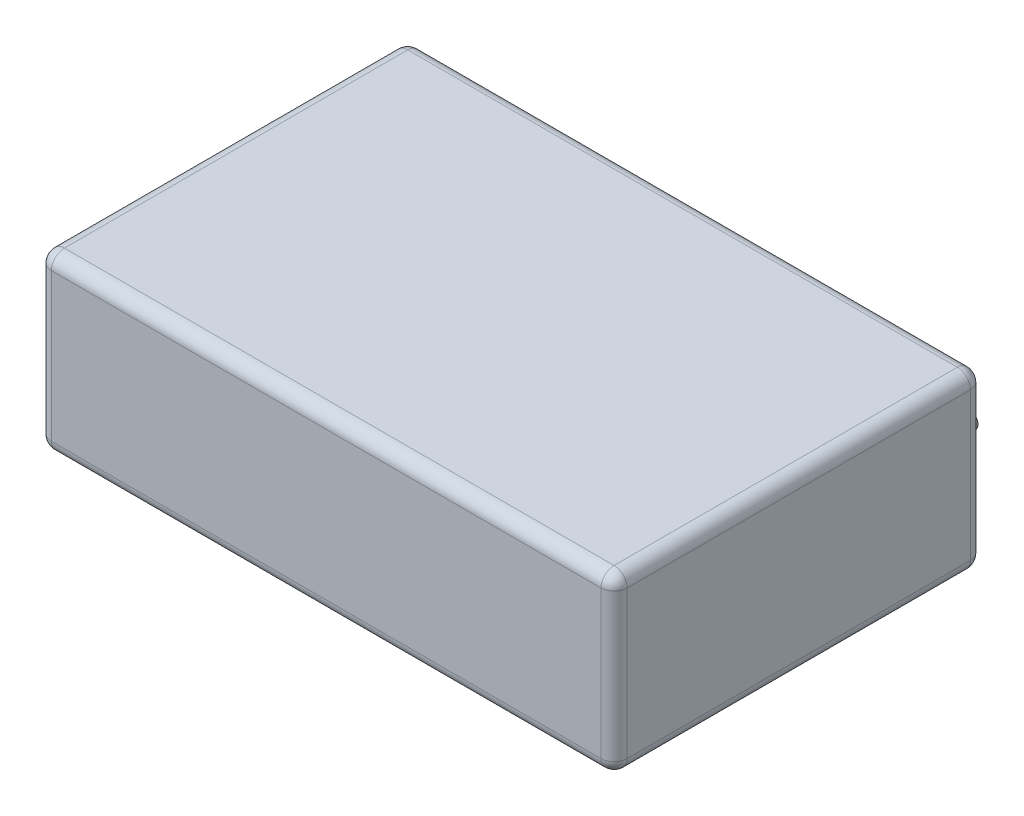
ISO-10303-21;
HEADER;
FILE_DESCRIPTION(('STEP AP214'),'2;1');
FILE_NAME('part.step','',(''),(''),'','','');
FILE_SCHEMA(('AUTOMOTIVE_DESIGN { 1 0 10303 214 1 1 1 1 }'));
ENDSEC;
DATA;
#1=APPLICATION_CONTEXT('core data for automotive mechanical design processes');
#2=APPLICATION_PROTOCOL_DEFINITION('international standard','automotive_design',2000,#1);
#3=PRODUCT_CONTEXT('',#1,'mechanical');
#4=PRODUCT('Part','Part','',(#3));
#5=PRODUCT_RELATED_PRODUCT_CATEGORY('part','',(#4));
#6=PRODUCT_DEFINITION_FORMATION('','',#4);
#7=PRODUCT_DEFINITION_CONTEXT('part definition',#1,'design');
#8=PRODUCT_DEFINITION('design','',#6,#7);
#9=PRODUCT_DEFINITION_SHAPE('','',#8);
#10=(LENGTH_UNIT() NAMED_UNIT(*) SI_UNIT(.MILLI.,.METRE.));
#11=(NAMED_UNIT(*) PLANE_ANGLE_UNIT() SI_UNIT($,.RADIAN.));
#12=(NAMED_UNIT(*) SI_UNIT($,.STERADIAN.) SOLID_ANGLE_UNIT());
#13=UNCERTAINTY_MEASURE_WITH_UNIT(LENGTH_MEASURE(1.E-05),#10,'distance_accuracy_value','');
#14=(GEOMETRIC_REPRESENTATION_CONTEXT(3) GLOBAL_UNCERTAINTY_ASSIGNED_CONTEXT((#13)) GLOBAL_UNIT_ASSIGNED_CONTEXT((#10,
#11,#12)) REPRESENTATION_CONTEXT('',''));
#15=CARTESIAN_POINT('',(0.,0.,0.));
#16=DIRECTION('',(0.,0.,1.));
#17=DIRECTION('',(1.,0.,0.));
#18=AXIS2_PLACEMENT_3D('',#15,#16,#17);
#19=CARTESIAN_POINT('',(-13.25,-3.99999999999999,0.));
#20=DIRECTION('',(0.,0.,1.));
#21=DIRECTION('',(1.,0.,0.));
#22=AXIS2_PLACEMENT_3D('',#19,#20,#21);
#23=PLANE('',#22);
#24=CARTESIAN_POINT('',(-10.9999999999999,0.,0.));
#25=DIRECTION('',(0.,0.,1.));
#26=DIRECTION('',(1.,0.,0.));
#27=AXIS2_PLACEMENT_3D('',#24,#25,#26);
#28=CIRCLE('',#27,0.400000000000001);
#29=CARTESIAN_POINT('',(-10.5999999999999,0.,0.));
#30=VERTEX_POINT('',#29);
#31=EDGE_CURVE('E43',#30,#30,#28,.F.);
#32=ORIENTED_EDGE('',*,*,#31,.F.);
#33=EDGE_LOOP('',(#32));
#34=FACE_BOUND('',#33,.T.);
#35=DIRECTION('',(-1.,0.,0.));
#36=VECTOR('',#35,1.);
#37=CARTESIAN_POINT('',(-13.25,3.39999999999999,0.));
#38=LINE('',#37,#36);
#39=CARTESIAN_POINT('',(-12.65,3.39999999999999,0.));
#40=VERTEX_POINT('',#39);
#41=CARTESIAN_POINT('',(12.65,3.39999999999999,0.));
#42=VERTEX_POINT('',#41);
#43=EDGE_CURVE('E176',#40,#42,#38,.F.);
#44=ORIENTED_EDGE('',*,*,#43,.T.);
#45=DIRECTION('',(0.,1.,0.));
#46=VECTOR('',#45,1.);
#47=CARTESIAN_POINT('',(12.65,-3.99999999999981,0.));
#48=LINE('',#47,#46);
#49=CARTESIAN_POINT('',(12.65,-3.39999999999999,0.));
#50=VERTEX_POINT('',#49);
#51=EDGE_CURVE('E178',#42,#50,#48,.F.);
#52=ORIENTED_EDGE('',*,*,#51,.T.);
#53=DIRECTION('',(1.,0.,0.));
#54=VECTOR('',#53,1.);
#55=CARTESIAN_POINT('',(-13.25,-3.39999999999999,0.));
#56=LINE('',#55,#54);
#57=CARTESIAN_POINT('',(-12.65,-3.39999999999999,0.));
#58=VERTEX_POINT('',#57);
#59=EDGE_CURVE('E172',#50,#58,#56,.F.);
#60=ORIENTED_EDGE('',*,*,#59,.T.);
#61=DIRECTION('',(0.,-1.,0.));
#62=VECTOR('',#61,1.);
#63=CARTESIAN_POINT('',(-12.65,-3.99999999999999,0.));
#64=LINE('',#63,#62);
#65=EDGE_CURVE('E174',#58,#40,#64,.F.);
#66=ORIENTED_EDGE('',*,*,#65,.T.);
#67=EDGE_LOOP('',(#44,#52,#60,#66));
#68=FACE_BOUND('',#67,.T.);
#69=CARTESIAN_POINT('',(10.9999999999999,0.,0.));
#70=DIRECTION('',(0.,0.,1.));
#71=DIRECTION('',(1.,0.,0.));
#72=AXIS2_PLACEMENT_3D('',#69,#70,#71);
#73=CIRCLE('',#72,0.400000000000001);
#74=CARTESIAN_POINT('',(11.3999999999999,0.,0.));
#75=VERTEX_POINT('',#74);
#76=EDGE_CURVE('E11',#75,#75,#73,.F.);
#77=ORIENTED_EDGE('',*,*,#76,.F.);
#78=EDGE_LOOP('',(#77));
#79=FACE_BOUND('',#78,.T.);
#80=ADVANCED_FACE('F35',(#34,#68,#79),#23,.F.);
#81=CARTESIAN_POINT('',(13.25,-3.99999999999999,17.));
#82=DIRECTION('',(0.,1.,0.));
#83=DIRECTION('',(0.,0.,1.));
#84=AXIS2_PLACEMENT_3D('',#81,#82,#83);
#85=PLANE('',#84);
#86=DIRECTION('',(0.,0.,-1.));
#87=VECTOR('',#86,1.);
#88=CARTESIAN_POINT('',(-12.65,-3.99999999999999,17.));
#89=LINE('',#88,#87);
#90=CARTESIAN_POINT('',(-12.65,-3.99999999999999,16.4));
#91=VERTEX_POINT('',#90);
#92=CARTESIAN_POINT('',(-12.65,-3.99999999999999,0.6));
#93=VERTEX_POINT('',#92);
#94=EDGE_CURVE('E203',#91,#93,#89,.T.);
#95=ORIENTED_EDGE('',*,*,#94,.T.);
#96=DIRECTION('',(1.,0.,0.));
#97=VECTOR('',#96,1.);
#98=CARTESIAN_POINT('',(13.25,-3.99999999999999,0.6));
#99=LINE('',#98,#97);
#100=CARTESIAN_POINT('',(12.65,-3.99999999999999,0.6));
#101=VERTEX_POINT('',#100);
#102=EDGE_CURVE('E205',#93,#101,#99,.T.);
#103=ORIENTED_EDGE('',*,*,#102,.T.);
#104=DIRECTION('',(0.,0.,-1.));
#105=VECTOR('',#104,1.);
#106=CARTESIAN_POINT('',(12.65,-3.99999999999999,17.));
#107=LINE('',#106,#105);
#108=CARTESIAN_POINT('',(12.65,-3.99999999999999,16.4));
#109=VERTEX_POINT('',#108);
#110=EDGE_CURVE('E199',#101,#109,#107,.F.);
#111=ORIENTED_EDGE('',*,*,#110,.T.);
#112=DIRECTION('',(1.,0.,0.));
#113=VECTOR('',#112,1.);
#114=CARTESIAN_POINT('',(-13.25,-3.99999999999999,16.4));
#115=LINE('',#114,#113);
#116=EDGE_CURVE('E201',#109,#91,#115,.F.);
#117=ORIENTED_EDGE('',*,*,#116,.T.);
#118=EDGE_LOOP('',(#95,#103,#111,#117));
#119=FACE_BOUND('',#118,.T.);
#120=ADVANCED_FACE('F268',(#119),#85,.F.);
#121=CARTESIAN_POINT('',(13.25,3.99999999999999,17.));
#122=DIRECTION('',(-1.,0.,0.));
#123=DIRECTION('',(0.,-1.,0.));
#124=AXIS2_PLACEMENT_3D('',#121,#122,#123);
#125=PLANE('',#124);
#126=DIRECTION('',(0.,1.,0.));
#127=VECTOR('',#126,1.);
#128=CARTESIAN_POINT('',(13.25,3.99999999999999,0.6));
#129=LINE('',#128,#127);
#130=CARTESIAN_POINT('',(13.25,-3.39999999999998,0.6));
#131=VERTEX_POINT('',#130);
#132=CARTESIAN_POINT('',(13.25,3.39999999999999,0.6));
#133=VERTEX_POINT('',#132);
#134=EDGE_CURVE('E137',#131,#133,#129,.T.);
#135=ORIENTED_EDGE('',*,*,#134,.T.);
#136=DIRECTION('',(0.,0.,-1.));
#137=VECTOR('',#136,1.);
#138=CARTESIAN_POINT('',(13.25,3.39999999999999,17.));
#139=LINE('',#138,#137);
#140=CARTESIAN_POINT('',(13.25,3.39999999999999,16.4));
#141=VERTEX_POINT('',#140);
#142=EDGE_CURVE('E133',#133,#141,#139,.F.);
#143=ORIENTED_EDGE('',*,*,#142,.T.);
#144=DIRECTION('',(0.,1.,0.));
#145=VECTOR('',#144,1.);
#146=CARTESIAN_POINT('',(13.25,-3.99999999999999,16.4));
#147=LINE('',#146,#145);
#148=CARTESIAN_POINT('',(13.25,-3.39999999999998,16.4));
#149=VERTEX_POINT('',#148);
#150=EDGE_CURVE('E125',#141,#149,#147,.F.);
#151=ORIENTED_EDGE('',*,*,#150,.T.);
#152=DIRECTION('',(0.,0.,-1.));
#153=VECTOR('',#152,1.);
#154=CARTESIAN_POINT('',(13.25,-3.39999999999998,17.));
#155=LINE('',#154,#153);
#156=EDGE_CURVE('E130',#149,#131,#155,.T.);
#157=ORIENTED_EDGE('',*,*,#156,.T.);
#158=EDGE_LOOP('',(#135,#143,#151,#157));
#159=FACE_BOUND('',#158,.T.);
#160=ADVANCED_FACE('F128',(#159),#125,.F.);
#161=CARTESIAN_POINT('',(13.25,3.99999999999999,17.));
#162=DIRECTION('',(0.,-1.,0.));
#163=DIRECTION('',(0.,0.,-1.));
#164=AXIS2_PLACEMENT_3D('',#161,#162,#163);
#165=PLANE('',#164);
#166=DIRECTION('',(0.,0.,-1.));
#167=VECTOR('',#166,1.);
#168=CARTESIAN_POINT('',(12.65,3.99999999999999,17.));
#169=LINE('',#168,#167);
#170=CARTESIAN_POINT('',(12.65,3.99999999999999,16.4));
#171=VERTEX_POINT('',#170);
#172=CARTESIAN_POINT('',(12.65,3.99999999999999,0.6));
#173=VERTEX_POINT('',#172);
#174=EDGE_CURVE('E181',#171,#173,#169,.T.);
#175=ORIENTED_EDGE('',*,*,#174,.T.);
#176=DIRECTION('',(-1.,0.,0.));
#177=VECTOR('',#176,1.);
#178=CARTESIAN_POINT('',(13.25,3.99999999999999,0.6));
#179=LINE('',#178,#177);
#180=CARTESIAN_POINT('',(-12.65,3.99999999999999,0.6));
#181=VERTEX_POINT('',#180);
#182=EDGE_CURVE('E187',#173,#181,#179,.T.);
#183=ORIENTED_EDGE('',*,*,#182,.T.);
#184=DIRECTION('',(0.,0.,-1.));
#185=VECTOR('',#184,1.);
#186=CARTESIAN_POINT('',(-12.65,3.99999999999999,17.));
#187=LINE('',#186,#185);
#188=CARTESIAN_POINT('',(-12.65,3.99999999999999,16.4));
#189=VERTEX_POINT('',#188);
#190=EDGE_CURVE('E185',#181,#189,#187,.F.);
#191=ORIENTED_EDGE('',*,*,#190,.T.);
#192=DIRECTION('',(-1.,0.,0.));
#193=VECTOR('',#192,1.);
#194=CARTESIAN_POINT('',(13.25,3.99999999999999,16.4));
#195=LINE('',#194,#193);
#196=EDGE_CURVE('E183',#189,#171,#195,.F.);
#197=ORIENTED_EDGE('',*,*,#196,.T.);
#198=EDGE_LOOP('',(#175,#183,#191,#197));
#199=FACE_BOUND('',#198,.T.);
#200=ADVANCED_FACE('F301',(#199),#165,.F.);
#201=CARTESIAN_POINT('',(-13.25,3.99999999999999,17.));
#202=DIRECTION('',(1.,0.,0.));
#203=DIRECTION('',(0.,0.,-1.));
#204=AXIS2_PLACEMENT_3D('',#201,#202,#203);
#205=PLANE('',#204);
#206=DIRECTION('',(0.,0.,-1.));
#207=VECTOR('',#206,1.);
#208=CARTESIAN_POINT('',(-13.25,3.39999999999999,17.));
#209=LINE('',#208,#207);
#210=CARTESIAN_POINT('',(-13.25,3.39999999999999,16.4));
#211=VERTEX_POINT('',#210);
#212=CARTESIAN_POINT('',(-13.25,3.39999999999999,0.6));
#213=VERTEX_POINT('',#212);
#214=EDGE_CURVE('E194',#211,#213,#209,.T.);
#215=ORIENTED_EDGE('',*,*,#214,.T.);
#216=DIRECTION('',(0.,-1.,0.));
#217=VECTOR('',#216,1.);
#218=CARTESIAN_POINT('',(-13.25,3.99999999999999,0.6));
#219=LINE('',#218,#217);
#220=CARTESIAN_POINT('',(-13.25,-3.39999999999999,0.6));
#221=VERTEX_POINT('',#220);
#222=EDGE_CURVE('E196',#213,#221,#219,.T.);
#223=ORIENTED_EDGE('',*,*,#222,.T.);
#224=DIRECTION('',(0.,0.,-1.));
#225=VECTOR('',#224,1.);
#226=CARTESIAN_POINT('',(-13.25,-3.39999999999999,17.));
#227=LINE('',#226,#225);
#228=CARTESIAN_POINT('',(-13.25,-3.39999999999999,16.4));
#229=VERTEX_POINT('',#228);
#230=EDGE_CURVE('E192',#221,#229,#227,.F.);
#231=ORIENTED_EDGE('',*,*,#230,.T.);
#232=DIRECTION('',(0.,-1.,0.));
#233=VECTOR('',#232,1.);
#234=CARTESIAN_POINT('',(-13.25,3.99999999999999,16.4));
#235=LINE('',#234,#233);
#236=EDGE_CURVE('E190',#229,#211,#235,.F.);
#237=ORIENTED_EDGE('',*,*,#236,.T.);
#238=EDGE_LOOP('',(#215,#223,#231,#237));
#239=FACE_BOUND('',#238,.T.);
#240=ADVANCED_FACE('F297',(#239),#205,.F.);
#241=CARTESIAN_POINT('',(-13.25,-3.99999999999999,17.));
#242=DIRECTION('',(0.,0.,1.));
#243=DIRECTION('',(1.,0.,0.));
#244=AXIS2_PLACEMENT_3D('',#241,#242,#243);
#245=PLANE('',#244);
#246=DIRECTION('',(-1.,0.,0.));
#247=VECTOR('',#246,1.);
#248=CARTESIAN_POINT('',(-13.25,3.39999999999999,17.));
#249=LINE('',#248,#247);
#250=CARTESIAN_POINT('',(12.65,3.39999999999999,17.));
#251=VERTEX_POINT('',#250);
#252=CARTESIAN_POINT('',(-12.65,3.39999999999999,17.));
#253=VERTEX_POINT('',#252);
#254=EDGE_CURVE('E58',#251,#253,#249,.T.);
#255=ORIENTED_EDGE('',*,*,#254,.T.);
#256=DIRECTION('',(0.,-1.,0.));
#257=VECTOR('',#256,1.);
#258=CARTESIAN_POINT('',(-12.65,-3.99999999999999,17.));
#259=LINE('',#258,#257);
#260=CARTESIAN_POINT('',(-12.65,-3.39999999999999,17.));
#261=VERTEX_POINT('',#260);
#262=EDGE_CURVE('E211',#253,#261,#259,.T.);
#263=ORIENTED_EDGE('',*,*,#262,.T.);
#264=DIRECTION('',(1.,0.,0.));
#265=VECTOR('',#264,1.);
#266=CARTESIAN_POINT('',(13.25,-3.39999999999999,17.));
#267=LINE('',#266,#265);
#268=CARTESIAN_POINT('',(12.65,-3.39999999999999,17.));
#269=VERTEX_POINT('',#268);
#270=EDGE_CURVE('E50',#261,#269,#267,.T.);
#271=ORIENTED_EDGE('',*,*,#270,.T.);
#272=DIRECTION('',(0.,1.,0.));
#273=VECTOR('',#272,1.);
#274=CARTESIAN_POINT('',(12.65,3.99999999999998,17.));
#275=LINE('',#274,#273);
#276=EDGE_CURVE('E144',#269,#251,#275,.T.);
#277=ORIENTED_EDGE('',*,*,#276,.T.);
#278=EDGE_LOOP('',(#255,#263,#271,#277));
#279=FACE_BOUND('',#278,.T.);
#280=ADVANCED_FACE('F295',(#279),#245,.T.);
#281=CARTESIAN_POINT('',(-12.65,-3.99999999999999,16.4));
#282=DIRECTION('',(0.,1.,0.));
#283=DIRECTION('',(0.,0.,1.));
#284=AXIS2_PLACEMENT_3D('',#281,#282,#283);
#285=CYLINDRICAL_SURFACE('',#284,0.6);
#286=CARTESIAN_POINT('',(-12.65,-3.39999999999999,16.4));
#287=DIRECTION('',(0.,-1.,0.));
#288=DIRECTION('',(0.,0.,-1.));
#289=AXIS2_PLACEMENT_3D('',#286,#287,#288);
#290=CIRCLE('',#289,0.6);
#291=EDGE_CURVE('E161',#261,#229,#290,.T.);
#292=ORIENTED_EDGE('',*,*,#291,.F.);
#293=ORIENTED_EDGE('',*,*,#262,.F.);
#294=CARTESIAN_POINT('',(-12.65,3.39999999999999,16.4));
#295=DIRECTION('',(0.,1.,0.));
#296=DIRECTION('',(0.,0.,1.));
#297=AXIS2_PLACEMENT_3D('',#294,#295,#296);
#298=CIRCLE('',#297,0.6);
#299=EDGE_CURVE('E164',#211,#253,#298,.T.);
#300=ORIENTED_EDGE('',*,*,#299,.F.);
#301=ORIENTED_EDGE('',*,*,#236,.F.);
#302=EDGE_LOOP('',(#292,#293,#300,#301));
#303=FACE_BOUND('',#302,.T.);
#304=ADVANCED_FACE('F37',(#303),#285,.T.);
#305=CARTESIAN_POINT('',(-12.65,-3.39999999999999,16.4));
#306=DIRECTION('',(0.,0.,1.));
#307=DIRECTION('',(1.,0.,0.));
#308=AXIS2_PLACEMENT_3D('',#305,#306,#307);
#309=SPHERICAL_SURFACE('',#308,0.6);
#310=CARTESIAN_POINT('',(-12.65,-3.39999999999999,16.4));
#311=DIRECTION('',(-1.,0.,0.));
#312=DIRECTION('',(0.,0.,1.));
#313=AXIS2_PLACEMENT_3D('',#310,#311,#312);
#314=CIRCLE('',#313,0.6);
#315=EDGE_CURVE('E255',#261,#91,#314,.F.);
#316=ORIENTED_EDGE('',*,*,#315,.F.);
#317=ORIENTED_EDGE('',*,*,#291,.T.);
#318=CARTESIAN_POINT('',(-12.65,-3.39999999999999,16.4));
#319=DIRECTION('',(0.,0.,1.));
#320=DIRECTION('',(1.,0.,0.));
#321=AXIS2_PLACEMENT_3D('',#318,#319,#320);
#322=CIRCLE('',#321,0.6);
#323=EDGE_CURVE('E257',#91,#229,#322,.F.);
#324=ORIENTED_EDGE('',*,*,#323,.F.);
#325=EDGE_LOOP('',(#316,#317,#324));
#326=FACE_BOUND('',#325,.T.);
#327=ADVANCED_FACE('F373',(#326),#309,.T.);
#328=CARTESIAN_POINT('',(-12.65,3.39999999999999,16.4));
#329=DIRECTION('',(0.,0.,1.));
#330=DIRECTION('',(1.,0.,0.));
#331=AXIS2_PLACEMENT_3D('',#328,#329,#330);
#332=SPHERICAL_SURFACE('',#331,0.6);
#333=CARTESIAN_POINT('',(-12.65,3.39999999999999,16.4));
#334=DIRECTION('',(0.,0.,1.));
#335=DIRECTION('',(1.,0.,0.));
#336=AXIS2_PLACEMENT_3D('',#333,#334,#335);
#337=CIRCLE('',#336,0.6);
#338=EDGE_CURVE('E249',#211,#189,#337,.F.);
#339=ORIENTED_EDGE('',*,*,#338,.F.);
#340=ORIENTED_EDGE('',*,*,#299,.T.);
#341=CARTESIAN_POINT('',(-12.65,3.39999999999999,16.4));
#342=DIRECTION('',(-1.,0.,0.));
#343=DIRECTION('',(0.,0.,1.));
#344=AXIS2_PLACEMENT_3D('',#341,#342,#343);
#345=CIRCLE('',#344,0.6);
#346=EDGE_CURVE('E252',#189,#253,#345,.F.);
#347=ORIENTED_EDGE('',*,*,#346,.F.);
#348=EDGE_LOOP('',(#339,#340,#347));
#349=FACE_BOUND('',#348,.T.);
#350=ADVANCED_FACE('F370',(#349),#332,.T.);
#351=CARTESIAN_POINT('',(-12.65,-3.39999999999999,17.));
#352=DIRECTION('',(0.,0.,-1.));
#353=DIRECTION('',(-1.,0.,0.));
#354=AXIS2_PLACEMENT_3D('',#351,#352,#353);
#355=CYLINDRICAL_SURFACE('',#354,0.6);
#356=ORIENTED_EDGE('',*,*,#323,.T.);
#357=ORIENTED_EDGE('',*,*,#230,.F.);
#358=CARTESIAN_POINT('',(-12.65,-3.39999999999999,0.6));
#359=DIRECTION('',(0.,0.,-1.));
#360=DIRECTION('',(-1.,0.,0.));
#361=AXIS2_PLACEMENT_3D('',#358,#359,#360);
#362=CIRCLE('',#361,0.6);
#363=EDGE_CURVE('E244',#93,#221,#362,.T.);
#364=ORIENTED_EDGE('',*,*,#363,.F.);
#365=ORIENTED_EDGE('',*,*,#94,.F.);
#366=EDGE_LOOP('',(#356,#357,#364,#365));
#367=FACE_BOUND('',#366,.T.);
#368=ADVANCED_FACE('F367',(#367),#355,.T.);
#369=CARTESIAN_POINT('',(-13.25,-3.39999999999999,16.4));
#370=DIRECTION('',(-1.,0.,0.));
#371=DIRECTION('',(0.,0.,1.));
#372=AXIS2_PLACEMENT_3D('',#369,#370,#371);
#373=CYLINDRICAL_SURFACE('',#372,0.6);
#374=ORIENTED_EDGE('',*,*,#315,.T.);
#375=ORIENTED_EDGE('',*,*,#116,.F.);
#376=CARTESIAN_POINT('',(12.65,-3.39999999999999,16.4));
#377=DIRECTION('',(1.,0.,0.));
#378=DIRECTION('',(0.,0.,-1.));
#379=AXIS2_PLACEMENT_3D('',#376,#377,#378);
#380=CIRCLE('',#379,0.6);
#381=EDGE_CURVE('E147',#269,#109,#380,.T.);
#382=ORIENTED_EDGE('',*,*,#381,.F.);
#383=ORIENTED_EDGE('',*,*,#270,.F.);
#384=EDGE_LOOP('',(#374,#375,#382,#383));
#385=FACE_BOUND('',#384,.T.);
#386=ADVANCED_FACE('F364',(#385),#373,.T.);
#387=CARTESIAN_POINT('',(12.65,-3.99999999999981,16.4));
#388=DIRECTION('',(0.,-1.,0.));
#389=DIRECTION('',(1.,0.,0.));
#390=AXIS2_PLACEMENT_3D('',#387,#388,#389);
#391=CYLINDRICAL_SURFACE('',#390,0.6);
#392=CARTESIAN_POINT('',(12.65,3.39999999999999,16.4));
#393=DIRECTION('',(0.,1.,0.));
#394=DIRECTION('',(-1.,0.,0.));
#395=AXIS2_PLACEMENT_3D('',#392,#393,#394);
#396=CIRCLE('',#395,0.6);
#397=EDGE_CURVE('E148',#251,#141,#396,.T.);
#398=ORIENTED_EDGE('',*,*,#397,.F.);
#399=ORIENTED_EDGE('',*,*,#276,.F.);
#400=CARTESIAN_POINT('',(12.65,-3.39999999999999,16.4));
#401=DIRECTION('',(0.,-1.,0.));
#402=DIRECTION('',(1.,0.,0.));
#403=AXIS2_PLACEMENT_3D('',#400,#401,#402);
#404=CIRCLE('',#403,0.6);
#405=EDGE_CURVE('E141',#149,#269,#404,.T.);
#406=ORIENTED_EDGE('',*,*,#405,.F.);
#407=ORIENTED_EDGE('',*,*,#150,.F.);
#408=EDGE_LOOP('',(#398,#399,#406,#407));
#409=FACE_BOUND('',#408,.T.);
#410=ADVANCED_FACE('F143',(#409),#391,.T.);
#411=CARTESIAN_POINT('',(-13.25,3.39999999999999,16.4));
#412=DIRECTION('',(1.,0.,0.));
#413=DIRECTION('',(0.,0.,-1.));
#414=AXIS2_PLACEMENT_3D('',#411,#412,#413);
#415=CYLINDRICAL_SURFACE('',#414,0.6);
#416=ORIENTED_EDGE('',*,*,#346,.T.);
#417=ORIENTED_EDGE('',*,*,#254,.F.);
#418=CARTESIAN_POINT('',(12.65,3.39999999999999,16.4));
#419=DIRECTION('',(1.,0.,0.));
#420=DIRECTION('',(0.,0.,-1.));
#421=AXIS2_PLACEMENT_3D('',#418,#419,#420);
#422=CIRCLE('',#421,0.6);
#423=EDGE_CURVE('E239',#171,#251,#422,.T.);
#424=ORIENTED_EDGE('',*,*,#423,.F.);
#425=ORIENTED_EDGE('',*,*,#196,.F.);
#426=EDGE_LOOP('',(#416,#417,#424,#425));
#427=FACE_BOUND('',#426,.T.);
#428=ADVANCED_FACE('F357',(#427),#415,.T.);
#429=CARTESIAN_POINT('',(-12.65,3.39999999999999,17.));
#430=DIRECTION('',(0.,0.,-1.));
#431=DIRECTION('',(-1.,0.,0.));
#432=AXIS2_PLACEMENT_3D('',#429,#430,#431);
#433=CYLINDRICAL_SURFACE('',#432,0.6);
#434=ORIENTED_EDGE('',*,*,#338,.T.);
#435=ORIENTED_EDGE('',*,*,#190,.F.);
#436=CARTESIAN_POINT('',(-12.65,3.39999999999999,0.6));
#437=DIRECTION('',(0.,0.,-1.));
#438=DIRECTION('',(-1.,0.,0.));
#439=AXIS2_PLACEMENT_3D('',#436,#437,#438);
#440=CIRCLE('',#439,0.6);
#441=EDGE_CURVE('E236',#213,#181,#440,.T.);
#442=ORIENTED_EDGE('',*,*,#441,.F.);
#443=ORIENTED_EDGE('',*,*,#214,.F.);
#444=EDGE_LOOP('',(#434,#435,#442,#443));
#445=FACE_BOUND('',#444,.T.);
#446=ADVANCED_FACE('F353',(#445),#433,.T.);
#447=CARTESIAN_POINT('',(-12.65,3.99999999999999,0.6));
#448=DIRECTION('',(0.,-1.,0.));
#449=DIRECTION('',(0.,0.,-1.));
#450=AXIS2_PLACEMENT_3D('',#447,#448,#449);
#451=CYLINDRICAL_SURFACE('',#450,0.6);
#452=CARTESIAN_POINT('',(-12.65,-3.39999999999999,0.6));
#453=DIRECTION('',(0.,-1.,0.));
#454=DIRECTION('',(0.,0.,-1.));
#455=AXIS2_PLACEMENT_3D('',#452,#453,#454);
#456=CIRCLE('',#455,0.6);
#457=EDGE_CURVE('E246',#221,#58,#456,.T.);
#458=ORIENTED_EDGE('',*,*,#457,.F.);
#459=ORIENTED_EDGE('',*,*,#222,.F.);
#460=CARTESIAN_POINT('',(-12.65,3.39999999999999,0.6));
#461=DIRECTION('',(0.,1.,0.));
#462=DIRECTION('',(0.,0.,1.));
#463=AXIS2_PLACEMENT_3D('',#460,#461,#462);
#464=CIRCLE('',#463,0.6);
#465=EDGE_CURVE('E233',#40,#213,#464,.T.);
#466=ORIENTED_EDGE('',*,*,#465,.F.);
#467=ORIENTED_EDGE('',*,*,#65,.F.);
#468=EDGE_LOOP('',(#458,#459,#466,#467));
#469=FACE_BOUND('',#468,.T.);
#470=ADVANCED_FACE('F349',(#469),#451,.T.);
#471=CARTESIAN_POINT('',(-12.65,-3.39999999999999,0.6));
#472=DIRECTION('',(0.,0.,1.));
#473=DIRECTION('',(1.,0.,0.));
#474=AXIS2_PLACEMENT_3D('',#471,#472,#473);
#475=SPHERICAL_SURFACE('',#474,0.6);
#476=ORIENTED_EDGE('',*,*,#363,.T.);
#477=ORIENTED_EDGE('',*,*,#457,.T.);
#478=CARTESIAN_POINT('',(-12.65,-3.39999999999999,0.6));
#479=DIRECTION('',(-1.,0.,0.));
#480=DIRECTION('',(0.,0.,1.));
#481=AXIS2_PLACEMENT_3D('',#478,#479,#480);
#482=CIRCLE('',#481,0.6);
#483=EDGE_CURVE('E155',#93,#58,#482,.F.);
#484=ORIENTED_EDGE('',*,*,#483,.F.);
#485=EDGE_LOOP('',(#476,#477,#484));
#486=FACE_BOUND('',#485,.T.);
#487=ADVANCED_FACE('F346',(#486),#475,.T.);
#488=CARTESIAN_POINT('',(12.65,-3.39999999999999,16.4));
#489=DIRECTION('',(0.,0.,1.));
#490=DIRECTION('',(1.,0.,0.));
#491=AXIS2_PLACEMENT_3D('',#488,#489,#490);
#492=SPHERICAL_SURFACE('',#491,0.6);
#493=ORIENTED_EDGE('',*,*,#405,.T.);
#494=ORIENTED_EDGE('',*,*,#381,.T.);
#495=CARTESIAN_POINT('',(12.65,-3.39999999999999,16.4));
#496=DIRECTION('',(0.,0.,1.));
#497=DIRECTION('',(1.,0.,0.));
#498=AXIS2_PLACEMENT_3D('',#495,#496,#497);
#499=CIRCLE('',#498,0.6);
#500=EDGE_CURVE('E151',#149,#109,#499,.F.);
#501=ORIENTED_EDGE('',*,*,#500,.F.);
#502=EDGE_LOOP('',(#493,#494,#501));
#503=FACE_BOUND('',#502,.T.);
#504=ADVANCED_FACE('F152',(#503),#492,.T.);
#505=CARTESIAN_POINT('',(12.65,3.39999999999999,16.4));
#506=DIRECTION('',(0.,0.,1.));
#507=DIRECTION('',(1.,0.,0.));
#508=AXIS2_PLACEMENT_3D('',#505,#506,#507);
#509=SPHERICAL_SURFACE('',#508,0.6);
#510=ORIENTED_EDGE('',*,*,#423,.T.);
#511=ORIENTED_EDGE('',*,*,#397,.T.);
#512=CARTESIAN_POINT('',(12.65,3.39999999999999,16.4));
#513=DIRECTION('',(0.,0.,1.));
#514=DIRECTION('',(1.,0.,0.));
#515=AXIS2_PLACEMENT_3D('',#512,#513,#514);
#516=CIRCLE('',#515,0.6);
#517=EDGE_CURVE('E156',#171,#141,#516,.F.);
#518=ORIENTED_EDGE('',*,*,#517,.F.);
#519=EDGE_LOOP('',(#510,#511,#518));
#520=FACE_BOUND('',#519,.T.);
#521=ADVANCED_FACE('F339',(#520),#509,.T.);
#522=CARTESIAN_POINT('',(-12.65,3.39999999999999,0.6));
#523=DIRECTION('',(0.,0.,1.));
#524=DIRECTION('',(1.,0.,0.));
#525=AXIS2_PLACEMENT_3D('',#522,#523,#524);
#526=SPHERICAL_SURFACE('',#525,0.6);
#527=ORIENTED_EDGE('',*,*,#465,.T.);
#528=ORIENTED_EDGE('',*,*,#441,.T.);
#529=CARTESIAN_POINT('',(-12.65,3.39999999999999,0.6));
#530=DIRECTION('',(-1.,0.,0.));
#531=DIRECTION('',(0.,0.,1.));
#532=AXIS2_PLACEMENT_3D('',#529,#530,#531);
#533=CIRCLE('',#532,0.6);
#534=EDGE_CURVE('E227',#40,#181,#533,.F.);
#535=ORIENTED_EDGE('',*,*,#534,.F.);
#536=EDGE_LOOP('',(#527,#528,#535));
#537=FACE_BOUND('',#536,.T.);
#538=ADVANCED_FACE('F335',(#537),#526,.T.);
#539=CARTESIAN_POINT('',(13.25,-3.39999999999999,0.6));
#540=DIRECTION('',(1.,0.,0.));
#541=DIRECTION('',(0.,0.,-1.));
#542=AXIS2_PLACEMENT_3D('',#539,#540,#541);
#543=CYLINDRICAL_SURFACE('',#542,0.6);
#544=ORIENTED_EDGE('',*,*,#483,.T.);
#545=ORIENTED_EDGE('',*,*,#59,.F.);
#546=CARTESIAN_POINT('',(12.65,-3.39999999999999,0.6));
#547=DIRECTION('',(1.,0.,0.));
#548=DIRECTION('',(0.,0.,-1.));
#549=AXIS2_PLACEMENT_3D('',#546,#547,#548);
#550=CIRCLE('',#549,0.6);
#551=EDGE_CURVE('E224',#101,#50,#550,.T.);
#552=ORIENTED_EDGE('',*,*,#551,.F.);
#553=ORIENTED_EDGE('',*,*,#102,.F.);
#554=EDGE_LOOP('',(#544,#545,#552,#553));
#555=FACE_BOUND('',#554,.T.);
#556=ADVANCED_FACE('F332',(#555),#543,.T.);
#557=CARTESIAN_POINT('',(12.65,-3.39999999999999,17.));
#558=DIRECTION('',(0.,0.,-1.));
#559=DIRECTION('',(-1.,0.,0.));
#560=AXIS2_PLACEMENT_3D('',#557,#558,#559);
#561=CYLINDRICAL_SURFACE('',#560,0.6);
#562=ORIENTED_EDGE('',*,*,#500,.T.);
#563=ORIENTED_EDGE('',*,*,#110,.F.);
#564=CARTESIAN_POINT('',(12.65,-3.39999999999999,0.6));
#565=DIRECTION('',(0.,0.,-1.));
#566=DIRECTION('',(-1.,0.,0.));
#567=AXIS2_PLACEMENT_3D('',#564,#565,#566);
#568=CIRCLE('',#567,0.6);
#569=EDGE_CURVE('E159',#131,#101,#568,.T.);
#570=ORIENTED_EDGE('',*,*,#569,.F.);
#571=ORIENTED_EDGE('',*,*,#156,.F.);
#572=EDGE_LOOP('',(#562,#563,#570,#571));
#573=FACE_BOUND('',#572,.T.);
#574=ADVANCED_FACE('F158',(#573),#561,.T.);
#575=CARTESIAN_POINT('',(12.65,3.39999999999999,17.));
#576=DIRECTION('',(0.,0.,-1.));
#577=DIRECTION('',(-1.,0.,0.));
#578=AXIS2_PLACEMENT_3D('',#575,#576,#577);
#579=CYLINDRICAL_SURFACE('',#578,0.6);
#580=ORIENTED_EDGE('',*,*,#517,.T.);
#581=ORIENTED_EDGE('',*,*,#142,.F.);
#582=CARTESIAN_POINT('',(12.65,3.39999999999999,0.6));
#583=DIRECTION('',(0.,0.,-1.));
#584=DIRECTION('',(-1.,0.,0.));
#585=AXIS2_PLACEMENT_3D('',#582,#583,#584);
#586=CIRCLE('',#585,0.6);
#587=EDGE_CURVE('E220',#173,#133,#586,.T.);
#588=ORIENTED_EDGE('',*,*,#587,.F.);
#589=ORIENTED_EDGE('',*,*,#174,.F.);
#590=EDGE_LOOP('',(#580,#581,#588,#589));
#591=FACE_BOUND('',#590,.T.);
#592=ADVANCED_FACE('F325',(#591),#579,.T.);
#593=CARTESIAN_POINT('',(13.25,3.39999999999999,0.6));
#594=DIRECTION('',(-1.,0.,0.));
#595=DIRECTION('',(0.,0.,1.));
#596=AXIS2_PLACEMENT_3D('',#593,#594,#595);
#597=CYLINDRICAL_SURFACE('',#596,0.6);
#598=ORIENTED_EDGE('',*,*,#534,.T.);
#599=ORIENTED_EDGE('',*,*,#182,.F.);
#600=CARTESIAN_POINT('',(12.65,3.39999999999999,0.6));
#601=DIRECTION('',(1.,0.,0.));
#602=DIRECTION('',(0.,0.,-1.));
#603=AXIS2_PLACEMENT_3D('',#600,#601,#602);
#604=CIRCLE('',#603,0.6);
#605=EDGE_CURVE('E217',#42,#173,#604,.T.);
#606=ORIENTED_EDGE('',*,*,#605,.F.);
#607=ORIENTED_EDGE('',*,*,#43,.F.);
#608=EDGE_LOOP('',(#598,#599,#606,#607));
#609=FACE_BOUND('',#608,.T.);
#610=ADVANCED_FACE('F321',(#609),#597,.T.);
#611=CARTESIAN_POINT('',(12.65,-3.39999999999999,0.6));
#612=DIRECTION('',(0.,0.,1.));
#613=DIRECTION('',(1.,0.,0.));
#614=AXIS2_PLACEMENT_3D('',#611,#612,#613);
#615=SPHERICAL_SURFACE('',#614,0.6);
#616=ORIENTED_EDGE('',*,*,#569,.T.);
#617=ORIENTED_EDGE('',*,*,#551,.T.);
#618=CARTESIAN_POINT('',(12.65,-3.39999999999999,0.6));
#619=DIRECTION('',(0.,-1.,0.));
#620=DIRECTION('',(1.,0.,0.));
#621=AXIS2_PLACEMENT_3D('',#618,#619,#620);
#622=CIRCLE('',#621,0.6);
#623=EDGE_CURVE('E215',#131,#50,#622,.F.);
#624=ORIENTED_EDGE('',*,*,#623,.F.);
#625=EDGE_LOOP('',(#616,#617,#624));
#626=FACE_BOUND('',#625,.T.);
#627=ADVANCED_FACE('F317',(#626),#615,.T.);
#628=CARTESIAN_POINT('',(12.65,3.39999999999999,0.6));
#629=DIRECTION('',(0.,0.,1.));
#630=DIRECTION('',(1.,0.,0.));
#631=AXIS2_PLACEMENT_3D('',#628,#629,#630);
#632=SPHERICAL_SURFACE('',#631,0.6);
#633=ORIENTED_EDGE('',*,*,#605,.T.);
#634=ORIENTED_EDGE('',*,*,#587,.T.);
#635=CARTESIAN_POINT('',(12.65,3.39999999999999,0.6));
#636=DIRECTION('',(0.,1.,0.));
#637=DIRECTION('',(-1.,0.,0.));
#638=AXIS2_PLACEMENT_3D('',#635,#636,#637);
#639=CIRCLE('',#638,0.6);
#640=EDGE_CURVE('E213',#42,#133,#639,.F.);
#641=ORIENTED_EDGE('',*,*,#640,.F.);
#642=EDGE_LOOP('',(#633,#634,#641));
#643=FACE_BOUND('',#642,.T.);
#644=ADVANCED_FACE('F313',(#643),#632,.T.);
#645=CARTESIAN_POINT('',(12.65,3.99999999999998,0.6));
#646=DIRECTION('',(0.,1.,0.));
#647=DIRECTION('',(-1.,0.,0.));
#648=AXIS2_PLACEMENT_3D('',#645,#646,#647);
#649=CYLINDRICAL_SURFACE('',#648,0.6);
#650=ORIENTED_EDGE('',*,*,#623,.T.);
#651=ORIENTED_EDGE('',*,*,#51,.F.);
#652=ORIENTED_EDGE('',*,*,#640,.T.);
#653=ORIENTED_EDGE('',*,*,#134,.F.);
#654=EDGE_LOOP('',(#650,#651,#652,#653));
#655=FACE_BOUND('',#654,.T.);
#656=ADVANCED_FACE('F293',(#655),#649,.T.);
#657=CARTESIAN_POINT('',(-10.9999999999999,0.,-1.6));
#658=DIRECTION('',(0.,0.,1.));
#659=DIRECTION('',(1.,0.,0.));
#660=AXIS2_PLACEMENT_3D('',#657,#658,#659);
#661=CYLINDRICAL_SURFACE('',#660,0.400000000000001);
#662=CARTESIAN_POINT('',(-10.9999999999999,0.,-1.6));
#663=DIRECTION('',(0.,0.,-1.));
#664=DIRECTION('',(-1.,0.,0.));
#665=AXIS2_PLACEMENT_3D('',#662,#663,#664);
#666=CIRCLE('',#665,0.400000000000001);
#667=CARTESIAN_POINT('',(-11.3999999999999,0.,-1.6));
#668=VERTEX_POINT('',#667);
#669=EDGE_CURVE('E167',#668,#668,#666,.T.);
#670=ORIENTED_EDGE('',*,*,#669,.F.);
#671=EDGE_LOOP('',(#670));
#672=FACE_BOUND('',#671,.T.);
#673=ORIENTED_EDGE('',*,*,#31,.T.);
#674=EDGE_LOOP('',(#673));
#675=FACE_BOUND('',#674,.T.);
#676=ADVANCED_FACE('F264',(#672,#675),#661,.T.);
#677=CARTESIAN_POINT('',(-10.9999999999999,0.,-1.6));
#678=DIRECTION('',(0.,0.,-1.));
#679=DIRECTION('',(-1.,0.,0.));
#680=AXIS2_PLACEMENT_3D('',#677,#678,#679);
#681=PLANE('',#680);
#682=ORIENTED_EDGE('',*,*,#669,.T.);
#683=EDGE_LOOP('',(#682));
#684=FACE_BOUND('',#683,.T.);
#685=ADVANCED_FACE('F278',(#684),#681,.T.);
#686=CARTESIAN_POINT('',(10.9999999999999,0.,-1.6));
#687=DIRECTION('',(0.,0.,1.));
#688=DIRECTION('',(1.,0.,0.));
#689=AXIS2_PLACEMENT_3D('',#686,#687,#688);
#690=CYLINDRICAL_SURFACE('',#689,0.400000000000001);
#691=CARTESIAN_POINT('',(10.9999999999999,0.,-1.6));
#692=DIRECTION('',(0.,0.,-1.));
#693=DIRECTION('',(1.,0.,0.));
#694=AXIS2_PLACEMENT_3D('',#691,#692,#693);
#695=CIRCLE('',#694,0.400000000000001);
#696=CARTESIAN_POINT('',(11.3999999999999,0.,-1.6));
#697=VERTEX_POINT('',#696);
#698=EDGE_CURVE('E590',#697,#697,#695,.T.);
#699=ORIENTED_EDGE('',*,*,#698,.F.);
#700=EDGE_LOOP('',(#699));
#701=FACE_BOUND('',#700,.T.);
#702=ORIENTED_EDGE('',*,*,#76,.T.);
#703=EDGE_LOOP('',(#702));
#704=FACE_BOUND('',#703,.T.);
#705=ADVANCED_FACE('F275',(#701,#704),#690,.T.);
#706=CARTESIAN_POINT('',(10.9999999999999,0.,-1.6));
#707=DIRECTION('',(0.,0.,1.));
#708=DIRECTION('',(1.,0.,0.));
#709=AXIS2_PLACEMENT_3D('',#706,#707,#708);
#710=PLANE('',#709);
#711=ORIENTED_EDGE('',*,*,#698,.T.);
#712=EDGE_LOOP('',(#711));
#713=FACE_BOUND('',#712,.T.);
#714=ADVANCED_FACE('F277',(#713),#710,.F.);
#715=CLOSED_SHELL('',(#80,#120,#160,#200,#240,#280,#304,#327,#350,#368,#386,#410,#428,#446,#470,
#487,#504,#521,#538,#556,#574,#592,#610,#627,#644,#656,#676,#685,#705,#714));
#716=MANIFOLD_SOLID_BREP('B2',#715);
#717=ADVANCED_BREP_SHAPE_REPRESENTATION('',(#18,#716),#14);
#718=SHAPE_DEFINITION_REPRESENTATION(#9,#717);
ENDSEC;
END-ISO-10303-21;
